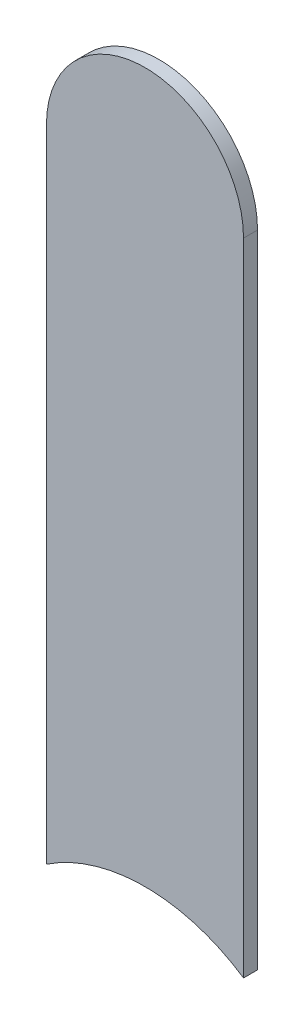
ISO-10303-21;
HEADER;
FILE_DESCRIPTION(('STEP AP214'),'2;1');
FILE_NAME('part.step','',(''),(''),'','','');
FILE_SCHEMA(('AUTOMOTIVE_DESIGN { 1 0 10303 214 1 1 1 1 }'));
ENDSEC;
DATA;
#1=APPLICATION_CONTEXT('core data for automotive mechanical design processes');
#2=APPLICATION_PROTOCOL_DEFINITION('international standard','automotive_design',2000,#1);
#3=PRODUCT_CONTEXT('',#1,'mechanical');
#4=PRODUCT('Part','Part','',(#3));
#5=PRODUCT_RELATED_PRODUCT_CATEGORY('part','',(#4));
#6=PRODUCT_DEFINITION_FORMATION('','',#4);
#7=PRODUCT_DEFINITION_CONTEXT('part definition',#1,'design');
#8=PRODUCT_DEFINITION('design','',#6,#7);
#9=PRODUCT_DEFINITION_SHAPE('','',#8);
#10=(LENGTH_UNIT() NAMED_UNIT(*) SI_UNIT(.MILLI.,.METRE.));
#11=(NAMED_UNIT(*) PLANE_ANGLE_UNIT() SI_UNIT($,.RADIAN.));
#12=(NAMED_UNIT(*) SI_UNIT($,.STERADIAN.) SOLID_ANGLE_UNIT());
#13=UNCERTAINTY_MEASURE_WITH_UNIT(LENGTH_MEASURE(1.E-05),#10,'distance_accuracy_value','');
#14=(GEOMETRIC_REPRESENTATION_CONTEXT(3) GLOBAL_UNCERTAINTY_ASSIGNED_CONTEXT((#13)) GLOBAL_UNIT_ASSIGNED_CONTEXT((#10,
#11,#12)) REPRESENTATION_CONTEXT('',''));
#15=CARTESIAN_POINT('',(0.,0.,0.));
#16=DIRECTION('',(0.,0.,1.));
#17=DIRECTION('',(1.,0.,0.));
#18=AXIS2_PLACEMENT_3D('',#15,#16,#17);
#19=CARTESIAN_POINT('',(48.65000938,54.3741585903459,0.));
#20=DIRECTION('',(-1.,0.,0.));
#21=DIRECTION('',(0.,1.,0.));
#22=AXIS2_PLACEMENT_3D('',#19,#20,#21);
#23=PLANE('',#22);
#24=DIRECTION('',(0.,1.,0.));
#25=VECTOR('',#24,1.);
#26=CARTESIAN_POINT('',(48.65000938,53.9999936,0.03556));
#27=LINE('',#26,#25);
#28=CARTESIAN_POINT('',(48.65000938,54.3741585903459,0.03556));
#29=VERTEX_POINT('',#28);
#30=CARTESIAN_POINT('',(48.65000938,56.00000992,0.03556));
#31=VERTEX_POINT('',#30);
#32=EDGE_CURVE('E11',#29,#31,#27,.T.);
#33=ORIENTED_EDGE('',*,*,#32,.F.);
#34=DIRECTION('',(0.,0.,1.));
#35=VECTOR('',#34,1.);
#36=CARTESIAN_POINT('',(48.65000938,54.3741585903459,0.));
#37=LINE('',#36,#35);
#38=CARTESIAN_POINT('',(48.65000938,54.3741585903459,0.));
#39=VERTEX_POINT('',#38);
#40=EDGE_CURVE('E24',#39,#29,#37,.T.);
#41=ORIENTED_EDGE('',*,*,#40,.F.);
#42=DIRECTION('',(0.,1.,0.));
#43=VECTOR('',#42,1.);
#44=CARTESIAN_POINT('',(48.65000938,53.9999936,0.));
#45=LINE('',#44,#43);
#46=CARTESIAN_POINT('',(48.65000938,56.00000992,0.));
#47=VERTEX_POINT('',#46);
#48=EDGE_CURVE('E75',#39,#47,#45,.T.);
#49=ORIENTED_EDGE('',*,*,#48,.T.);
#50=DIRECTION('',(0.,0.,1.));
#51=VECTOR('',#50,1.);
#52=CARTESIAN_POINT('',(48.65000938,56.00000992,0.));
#53=LINE('',#52,#51);
#54=EDGE_CURVE('E37',#47,#31,#53,.T.);
#55=ORIENTED_EDGE('',*,*,#54,.T.);
#56=EDGE_LOOP('',(#33,#41,#49,#55));
#57=FACE_BOUND('',#56,.T.);
#58=ADVANCED_FACE('F17',(#57),#23,.F.);
#59=CARTESIAN_POINT('',(48.40000988,56.00000992,0.));
#60=DIRECTION('',(0.,0.,-1.));
#61=DIRECTION('',(1.,0.,0.));
#62=AXIS2_PLACEMENT_3D('',#59,#60,#61);
#63=CYLINDRICAL_SURFACE('',#62,0.249999499999999);
#64=CARTESIAN_POINT('',(48.40000988,56.00000992,0.03556));
#65=DIRECTION('',(0.,0.,1.));
#66=DIRECTION('',(1.,0.,0.));
#67=AXIS2_PLACEMENT_3D('',#64,#65,#66);
#68=CIRCLE('',#67,0.249999499999999);
#69=CARTESIAN_POINT('',(48.15001038,56.00000992,0.03556));
#70=VERTEX_POINT('',#69);
#71=EDGE_CURVE('E83',#31,#70,#68,.T.);
#72=ORIENTED_EDGE('',*,*,#71,.F.);
#73=ORIENTED_EDGE('',*,*,#54,.F.);
#74=CARTESIAN_POINT('',(48.40000988,56.00000992,0.));
#75=DIRECTION('',(0.,0.,1.));
#76=DIRECTION('',(1.,0.,0.));
#77=AXIS2_PLACEMENT_3D('',#74,#75,#76);
#78=CIRCLE('',#77,0.249999499999999);
#79=CARTESIAN_POINT('',(48.15001038,56.00000992,0.));
#80=VERTEX_POINT('',#79);
#81=EDGE_CURVE('E81',#47,#80,#78,.T.);
#82=ORIENTED_EDGE('',*,*,#81,.T.);
#83=DIRECTION('',(0.,0.,1.));
#84=VECTOR('',#83,1.);
#85=CARTESIAN_POINT('',(48.15001038,56.00000992,0.));
#86=LINE('',#85,#84);
#87=EDGE_CURVE('E67',#80,#70,#86,.T.);
#88=ORIENTED_EDGE('',*,*,#87,.T.);
#89=EDGE_LOOP('',(#72,#73,#82,#88));
#90=FACE_BOUND('',#89,.T.);
#91=ADVANCED_FACE('F89',(#90),#63,.T.);
#92=CARTESIAN_POINT('',(48.15001038,56.00000992,0.));
#93=DIRECTION('',(1.,0.,0.));
#94=DIRECTION('',(0.,-1.,0.));
#95=AXIS2_PLACEMENT_3D('',#92,#93,#94);
#96=PLANE('',#95);
#97=DIRECTION('',(0.,-1.,0.));
#98=VECTOR('',#97,1.);
#99=CARTESIAN_POINT('',(48.15001038,56.00000992,0.03556));
#100=LINE('',#99,#98);
#101=CARTESIAN_POINT('',(48.15001038,54.3741585903459,0.03556));
#102=VERTEX_POINT('',#101);
#103=EDGE_CURVE('E71',#70,#102,#100,.T.);
#104=ORIENTED_EDGE('',*,*,#103,.F.);
#105=ORIENTED_EDGE('',*,*,#87,.F.);
#106=DIRECTION('',(0.,-1.,0.));
#107=VECTOR('',#106,1.);
#108=CARTESIAN_POINT('',(48.15001038,56.00000992,0.));
#109=LINE('',#108,#107);
#110=CARTESIAN_POINT('',(48.15001038,54.3741585903459,0.));
#111=VERTEX_POINT('',#110);
#112=EDGE_CURVE('E63',#80,#111,#109,.T.);
#113=ORIENTED_EDGE('',*,*,#112,.T.);
#114=DIRECTION('',(0.,0.,1.));
#115=VECTOR('',#114,1.);
#116=CARTESIAN_POINT('',(48.15001038,54.3741585903459,0.));
#117=LINE('',#116,#115);
#118=EDGE_CURVE('E53',#111,#102,#117,.T.);
#119=ORIENTED_EDGE('',*,*,#118,.T.);
#120=EDGE_LOOP('',(#104,#105,#113,#119));
#121=FACE_BOUND('',#120,.T.);
#122=ADVANCED_FACE('F66',(#121),#96,.F.);
#123=CARTESIAN_POINT('',(48.40000988,53.9999936,0.));
#124=DIRECTION('',(0.,0.,-1.));
#125=DIRECTION('',(1.,0.,0.));
#126=AXIS2_PLACEMENT_3D('',#123,#124,#125);
#127=CYLINDRICAL_SURFACE('',#126,0.4499991);
#128=ORIENTED_EDGE('',*,*,#40,.T.);
#129=CARTESIAN_POINT('',(48.40000988,53.9999936,0.03556));
#130=DIRECTION('',(0.,0.,1.));
#131=DIRECTION('',(1.,0.,0.));
#132=AXIS2_PLACEMENT_3D('',#129,#130,#131);
#133=CIRCLE('',#132,0.4499991);
#134=EDGE_CURVE('E59',#29,#102,#133,.T.);
#135=ORIENTED_EDGE('',*,*,#134,.T.);
#136=ORIENTED_EDGE('',*,*,#118,.F.);
#137=CARTESIAN_POINT('',(48.40000988,53.9999936,0.));
#138=DIRECTION('',(0.,0.,1.));
#139=DIRECTION('',(1.,0.,0.));
#140=AXIS2_PLACEMENT_3D('',#137,#138,#139);
#141=CIRCLE('',#140,0.4499991);
#142=EDGE_CURVE('E57',#39,#111,#141,.T.);
#143=ORIENTED_EDGE('',*,*,#142,.F.);
#144=EDGE_LOOP('',(#128,#135,#136,#143));
#145=FACE_BOUND('',#144,.T.);
#146=ADVANCED_FACE('F55',(#145),#127,.F.);
#147=CARTESIAN_POINT('',(48.65000938,53.9999936,0.));
#148=DIRECTION('',(0.,0.,-1.));
#149=DIRECTION('',(-1.,0.,0.));
#150=AXIS2_PLACEMENT_3D('',#147,#148,#149);
#151=PLANE('',#150);
#152=ORIENTED_EDGE('',*,*,#48,.F.);
#153=ORIENTED_EDGE('',*,*,#142,.T.);
#154=ORIENTED_EDGE('',*,*,#112,.F.);
#155=ORIENTED_EDGE('',*,*,#81,.F.);
#156=EDGE_LOOP('',(#152,#153,#154,#155));
#157=FACE_BOUND('',#156,.T.);
#158=ADVANCED_FACE('F74',(#157),#151,.T.);
#159=CARTESIAN_POINT('',(48.65000938,53.9999936,0.03556));
#160=DIRECTION('',(0.,0.,-1.));
#161=DIRECTION('',(-1.,0.,0.));
#162=AXIS2_PLACEMENT_3D('',#159,#160,#161);
#163=PLANE('',#162);
#164=ORIENTED_EDGE('',*,*,#134,.F.);
#165=ORIENTED_EDGE('',*,*,#32,.T.);
#166=ORIENTED_EDGE('',*,*,#71,.T.);
#167=ORIENTED_EDGE('',*,*,#103,.T.);
#168=EDGE_LOOP('',(#164,#165,#166,#167));
#169=FACE_BOUND('',#168,.T.);
#170=ADVANCED_FACE('F91',(#169),#163,.F.);
#171=CLOSED_SHELL('',(#58,#91,#122,#146,#158,#170));
#172=MANIFOLD_SOLID_BREP('B1',#171);
#173=ADVANCED_BREP_SHAPE_REPRESENTATION('',(#18,#172),#14);
#174=SHAPE_DEFINITION_REPRESENTATION(#9,#173);
ENDSEC;
END-ISO-10303-21;
